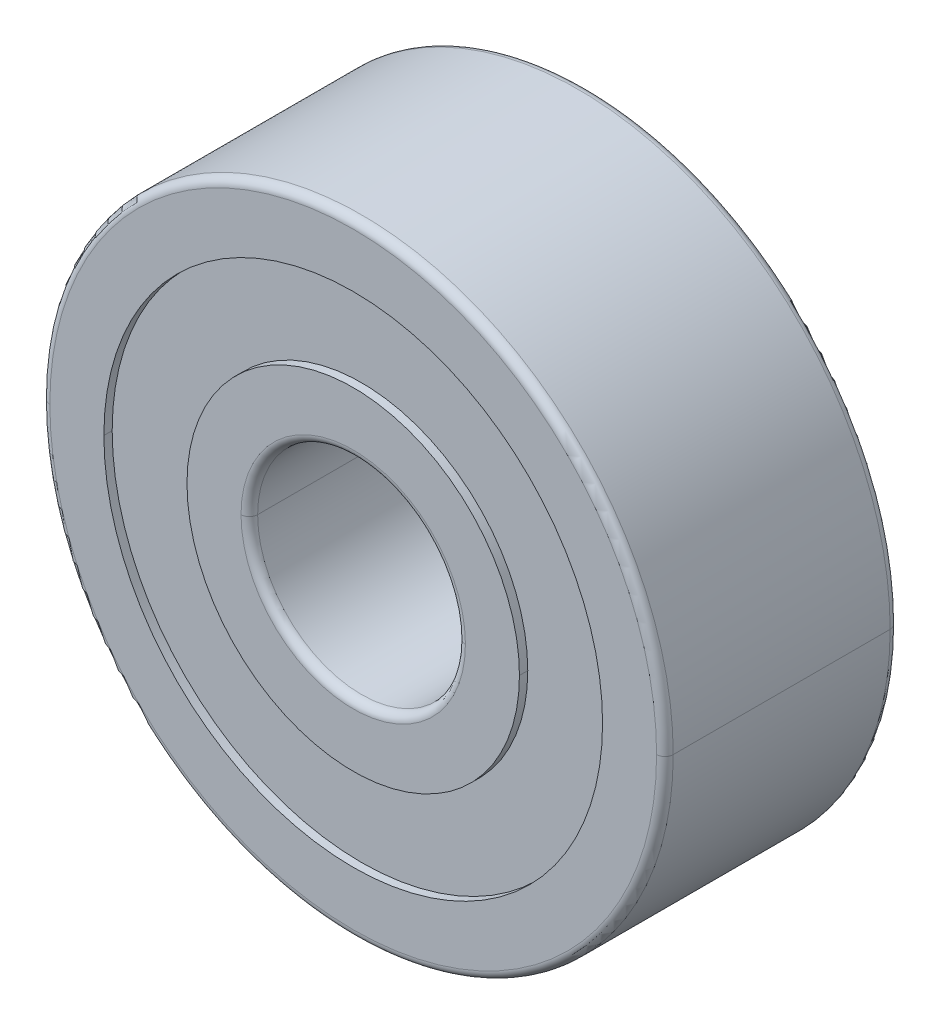
ISO-10303-21;
HEADER;
FILE_DESCRIPTION(('STEP AP214'),'2;1');
FILE_NAME('part.step','',(''),(''),'','','');
FILE_SCHEMA(('AUTOMOTIVE_DESIGN { 1 0 10303 214 1 1 1 1 }'));
ENDSEC;
DATA;
#1=APPLICATION_CONTEXT('core data for automotive mechanical design processes');
#2=APPLICATION_PROTOCOL_DEFINITION('international standard','automotive_design',2000,#1);
#3=PRODUCT_CONTEXT('',#1,'mechanical');
#4=PRODUCT('Part','Part','',(#3));
#5=PRODUCT_RELATED_PRODUCT_CATEGORY('part','',(#4));
#6=PRODUCT_DEFINITION_FORMATION('','',#4);
#7=PRODUCT_DEFINITION_CONTEXT('part definition',#1,'design');
#8=PRODUCT_DEFINITION('design','',#6,#7);
#9=PRODUCT_DEFINITION_SHAPE('','',#8);
#10=(LENGTH_UNIT() NAMED_UNIT(*) SI_UNIT(.MILLI.,.METRE.));
#11=(NAMED_UNIT(*) PLANE_ANGLE_UNIT() SI_UNIT($,.RADIAN.));
#12=(NAMED_UNIT(*) SI_UNIT($,.STERADIAN.) SOLID_ANGLE_UNIT());
#13=UNCERTAINTY_MEASURE_WITH_UNIT(LENGTH_MEASURE(1.E-05),#10,'distance_accuracy_value','');
#14=(GEOMETRIC_REPRESENTATION_CONTEXT(3) GLOBAL_UNCERTAINTY_ASSIGNED_CONTEXT((#13)) GLOBAL_UNIT_ASSIGNED_CONTEXT((#10,
#11,#12)) REPRESENTATION_CONTEXT('',''));
#15=CARTESIAN_POINT('',(0.,0.,0.));
#16=DIRECTION('',(0.,0.,1.));
#17=DIRECTION('',(1.,0.,0.));
#18=AXIS2_PLACEMENT_3D('',#15,#16,#17);
#19=CARTESIAN_POINT('',(0.,0.,3.3147));
#20=DIRECTION('',(0.,0.,1.));
#21=DIRECTION('',(1.,0.,0.));
#22=AXIS2_PLACEMENT_3D('',#19,#20,#21);
#23=TOROIDAL_SURFACE('',#22,9.271,0.254);
#24=CARTESIAN_POINT('',(-9.271,0.,3.3147));
#25=DIRECTION('',(0.,1.,0.));
#26=DIRECTION('',(-1.,0.,0.));
#27=AXIS2_PLACEMENT_3D('',#24,#25,#26);
#28=CIRCLE('',#27,0.254);
#29=CARTESIAN_POINT('',(-9.525,0.,3.3147));
#30=VERTEX_POINT('',#29);
#31=CARTESIAN_POINT('',(-9.271,0.,3.5687));
#32=VERTEX_POINT('',#31);
#33=EDGE_CURVE('E294',#30,#32,#28,.T.);
#34=ORIENTED_EDGE('',*,*,#33,.F.);
#35=CARTESIAN_POINT('',(0.,0.,3.3147));
#36=DIRECTION('',(0.,0.,-1.));
#37=DIRECTION('',(1.,0.,0.));
#38=AXIS2_PLACEMENT_3D('',#35,#36,#37);
#39=CIRCLE('',#38,9.525);
#40=CARTESIAN_POINT('',(9.525,0.,3.3147));
#41=VERTEX_POINT('',#40);
#42=EDGE_CURVE('E273',#41,#30,#39,.T.);
#43=ORIENTED_EDGE('',*,*,#42,.F.);
#44=CARTESIAN_POINT('',(9.271,0.,3.3147));
#45=DIRECTION('',(0.,-1.,0.));
#46=DIRECTION('',(0.,0.,-1.));
#47=AXIS2_PLACEMENT_3D('',#44,#45,#46);
#48=CIRCLE('',#47,0.254);
#49=CARTESIAN_POINT('',(9.271,0.,3.5687));
#50=VERTEX_POINT('',#49);
#51=EDGE_CURVE('E255',#41,#50,#48,.T.);
#52=ORIENTED_EDGE('',*,*,#51,.T.);
#53=CARTESIAN_POINT('',(0.,0.,3.5687));
#54=DIRECTION('',(0.,0.,1.));
#55=DIRECTION('',(1.,0.,0.));
#56=AXIS2_PLACEMENT_3D('',#53,#54,#55);
#57=CIRCLE('',#56,9.271);
#58=EDGE_CURVE('E249',#32,#50,#57,.T.);
#59=ORIENTED_EDGE('',*,*,#58,.F.);
#60=EDGE_LOOP('',(#34,#43,#52,#59));
#61=FACE_BOUND('',#60,.T.);
#62=ADVANCED_FACE('F14',(#61),#23,.T.);
#63=CARTESIAN_POINT('',(0.,0.,-3.3147));
#64=DIRECTION('',(0.,0.,1.));
#65=DIRECTION('',(1.,0.,0.));
#66=AXIS2_PLACEMENT_3D('',#63,#64,#65);
#67=TOROIDAL_SURFACE('',#66,9.271,0.254);
#68=CARTESIAN_POINT('',(-9.271,0.,-3.3147));
#69=DIRECTION('',(0.,1.,0.));
#70=DIRECTION('',(-1.,0.,0.));
#71=AXIS2_PLACEMENT_3D('',#68,#69,#70);
#72=CIRCLE('',#71,0.254);
#73=CARTESIAN_POINT('',(-9.271,0.,-3.5687));
#74=VERTEX_POINT('',#73);
#75=CARTESIAN_POINT('',(-9.525,0.,-3.3147));
#76=VERTEX_POINT('',#75);
#77=EDGE_CURVE('E254',#74,#76,#72,.T.);
#78=ORIENTED_EDGE('',*,*,#77,.F.);
#79=CARTESIAN_POINT('',(0.,0.,-3.5687));
#80=DIRECTION('',(0.,0.,-1.));
#81=DIRECTION('',(1.,0.,0.));
#82=AXIS2_PLACEMENT_3D('',#79,#80,#81);
#83=CIRCLE('',#82,9.271);
#84=CARTESIAN_POINT('',(9.271,0.,-3.5687));
#85=VERTEX_POINT('',#84);
#86=EDGE_CURVE('E248',#85,#74,#83,.T.);
#87=ORIENTED_EDGE('',*,*,#86,.F.);
#88=CARTESIAN_POINT('',(9.271,0.,-3.3147));
#89=DIRECTION('',(0.,-1.,0.));
#90=DIRECTION('',(0.,0.,-1.));
#91=AXIS2_PLACEMENT_3D('',#88,#89,#90);
#92=CIRCLE('',#91,0.254);
#93=CARTESIAN_POINT('',(9.525,0.,-3.3147));
#94=VERTEX_POINT('',#93);
#95=EDGE_CURVE('E328',#85,#94,#92,.T.);
#96=ORIENTED_EDGE('',*,*,#95,.T.);
#97=CARTESIAN_POINT('',(0.,0.,-3.3147));
#98=DIRECTION('',(0.,0.,1.));
#99=DIRECTION('',(1.,0.,0.));
#100=AXIS2_PLACEMENT_3D('',#97,#98,#99);
#101=CIRCLE('',#100,9.525);
#102=EDGE_CURVE('E276',#76,#94,#101,.T.);
#103=ORIENTED_EDGE('',*,*,#102,.F.);
#104=EDGE_LOOP('',(#78,#87,#96,#103));
#105=FACE_BOUND('',#104,.T.);
#106=ADVANCED_FACE('F428',(#105),#67,.T.);
#107=CARTESIAN_POINT('',(0.,0.,3.3147));
#108=DIRECTION('',(0.,0.,1.));
#109=DIRECTION('',(1.,0.,0.));
#110=AXIS2_PLACEMENT_3D('',#107,#108,#109);
#111=TOROIDAL_SURFACE('',#110,3.429,0.254);
#112=CARTESIAN_POINT('',(-3.429,0.,3.3147));
#113=DIRECTION('',(0.,1.,0.));
#114=DIRECTION('',(-1.,0.,0.));
#115=AXIS2_PLACEMENT_3D('',#112,#113,#114);
#116=CIRCLE('',#115,0.254);
#117=CARTESIAN_POINT('',(-3.429,0.,3.5687));
#118=VERTEX_POINT('',#117);
#119=CARTESIAN_POINT('',(-3.175,0.,3.3147));
#120=VERTEX_POINT('',#119);
#121=EDGE_CURVE('E327',#118,#120,#116,.T.);
#122=ORIENTED_EDGE('',*,*,#121,.F.);
#123=CARTESIAN_POINT('',(0.,0.,3.5687));
#124=DIRECTION('',(0.,0.,-1.));
#125=DIRECTION('',(1.,0.,0.));
#126=AXIS2_PLACEMENT_3D('',#123,#124,#125);
#127=CIRCLE('',#126,3.429);
#128=CARTESIAN_POINT('',(3.429,0.,3.5687));
#129=VERTEX_POINT('',#128);
#130=EDGE_CURVE('E287',#129,#118,#127,.T.);
#131=ORIENTED_EDGE('',*,*,#130,.F.);
#132=CARTESIAN_POINT('',(3.429,0.,3.3147));
#133=DIRECTION('',(0.,-1.,0.));
#134=DIRECTION('',(0.,0.,-1.));
#135=AXIS2_PLACEMENT_3D('',#132,#133,#134);
#136=CIRCLE('',#135,0.254);
#137=CARTESIAN_POINT('',(3.175,0.,3.3147));
#138=VERTEX_POINT('',#137);
#139=EDGE_CURVE('E227',#129,#138,#136,.T.);
#140=ORIENTED_EDGE('',*,*,#139,.T.);
#141=CARTESIAN_POINT('',(0.,0.,3.3147));
#142=DIRECTION('',(0.,0.,1.));
#143=DIRECTION('',(1.,0.,0.));
#144=AXIS2_PLACEMENT_3D('',#141,#142,#143);
#145=CIRCLE('',#144,3.175);
#146=EDGE_CURVE('E239',#120,#138,#145,.T.);
#147=ORIENTED_EDGE('',*,*,#146,.F.);
#148=EDGE_LOOP('',(#122,#131,#140,#147));
#149=FACE_BOUND('',#148,.T.);
#150=ADVANCED_FACE('F434',(#149),#111,.T.);
#151=CARTESIAN_POINT('',(0.,0.,-3.3147));
#152=DIRECTION('',(0.,0.,1.));
#153=DIRECTION('',(1.,0.,0.));
#154=AXIS2_PLACEMENT_3D('',#151,#152,#153);
#155=TOROIDAL_SURFACE('',#154,3.429,0.254);
#156=CARTESIAN_POINT('',(-3.429,0.,-3.3147));
#157=DIRECTION('',(0.,1.,0.));
#158=DIRECTION('',(-1.,0.,0.));
#159=AXIS2_PLACEMENT_3D('',#156,#157,#158);
#160=CIRCLE('',#159,0.254);
#161=CARTESIAN_POINT('',(-3.175,0.,-3.3147));
#162=VERTEX_POINT('',#161);
#163=CARTESIAN_POINT('',(-3.429,0.,-3.5687));
#164=VERTEX_POINT('',#163);
#165=EDGE_CURVE('E290',#162,#164,#160,.T.);
#166=ORIENTED_EDGE('',*,*,#165,.F.);
#167=CARTESIAN_POINT('',(0.,0.,-3.3147));
#168=DIRECTION('',(0.,0.,-1.));
#169=DIRECTION('',(1.,0.,0.));
#170=AXIS2_PLACEMENT_3D('',#167,#168,#169);
#171=CIRCLE('',#170,3.175);
#172=CARTESIAN_POINT('',(3.175,0.,-3.3147));
#173=VERTEX_POINT('',#172);
#174=EDGE_CURVE('E333',#173,#162,#171,.T.);
#175=ORIENTED_EDGE('',*,*,#174,.F.);
#176=CARTESIAN_POINT('',(3.429,0.,-3.3147));
#177=DIRECTION('',(0.,-1.,0.));
#178=DIRECTION('',(0.,0.,-1.));
#179=AXIS2_PLACEMENT_3D('',#176,#177,#178);
#180=CIRCLE('',#179,0.254);
#181=CARTESIAN_POINT('',(3.429,0.,-3.5687));
#182=VERTEX_POINT('',#181);
#183=EDGE_CURVE('E214',#173,#182,#180,.T.);
#184=ORIENTED_EDGE('',*,*,#183,.T.);
#185=CARTESIAN_POINT('',(0.,0.,-3.5687));
#186=DIRECTION('',(0.,0.,1.));
#187=DIRECTION('',(1.,0.,0.));
#188=AXIS2_PLACEMENT_3D('',#185,#186,#187);
#189=CIRCLE('',#188,3.429);
#190=EDGE_CURVE('E260',#164,#182,#189,.T.);
#191=ORIENTED_EDGE('',*,*,#190,.F.);
#192=EDGE_LOOP('',(#166,#175,#184,#191));
#193=FACE_BOUND('',#192,.T.);
#194=ADVANCED_FACE('F449',(#193),#155,.T.);
#195=CARTESIAN_POINT('',(0.,0.,-3.3147));
#196=DIRECTION('',(0.,0.,-1.));
#197=DIRECTION('',(-1.,0.,0.));
#198=AXIS2_PLACEMENT_3D('',#195,#196,#197);
#199=CYLINDRICAL_SURFACE('',#198,5.08);
#200=DIRECTION('',(0.,0.,-1.));
#201=VECTOR('',#200,1.);
#202=CARTESIAN_POINT('',(5.08,0.,-3.3147));
#203=LINE('',#202,#201);
#204=CARTESIAN_POINT('',(5.08,0.,-3.3147));
#205=VERTEX_POINT('',#204);
#206=CARTESIAN_POINT('',(5.08,0.,-3.5687));
#207=VERTEX_POINT('',#206);
#208=EDGE_CURVE('E202',#205,#207,#203,.T.);
#209=ORIENTED_EDGE('',*,*,#208,.F.);
#210=CARTESIAN_POINT('',(0.,0.,-3.3147));
#211=DIRECTION('',(0.,0.,1.));
#212=DIRECTION('',(1.,0.,0.));
#213=AXIS2_PLACEMENT_3D('',#210,#211,#212);
#214=CIRCLE('',#213,5.08);
#215=CARTESIAN_POINT('',(-5.08,0.,-3.3147));
#216=VERTEX_POINT('',#215);
#217=EDGE_CURVE('E9',#216,#205,#214,.T.);
#218=ORIENTED_EDGE('',*,*,#217,.F.);
#219=DIRECTION('',(0.,0.,-1.));
#220=VECTOR('',#219,1.);
#221=CARTESIAN_POINT('',(-5.08,0.,-3.3147));
#222=LINE('',#221,#220);
#223=CARTESIAN_POINT('',(-5.08,0.,-3.5687));
#224=VERTEX_POINT('',#223);
#225=EDGE_CURVE('E212',#216,#224,#222,.T.);
#226=ORIENTED_EDGE('',*,*,#225,.T.);
#227=CARTESIAN_POINT('',(0.,0.,-3.5687));
#228=DIRECTION('',(0.,0.,1.));
#229=DIRECTION('',(1.,0.,0.));
#230=AXIS2_PLACEMENT_3D('',#227,#228,#229);
#231=CIRCLE('',#230,5.08);
#232=EDGE_CURVE('E204',#224,#207,#231,.T.);
#233=ORIENTED_EDGE('',*,*,#232,.T.);
#234=EDGE_LOOP('',(#209,#218,#226,#233));
#235=FACE_BOUND('',#234,.T.);
#236=ADVANCED_FACE('F203',(#235),#199,.T.);
#237=CARTESIAN_POINT('',(0.,0.,-3.3147));
#238=DIRECTION('',(0.,0.,-1.));
#239=DIRECTION('',(-1.,0.,0.));
#240=AXIS2_PLACEMENT_3D('',#237,#238,#239);
#241=CYLINDRICAL_SURFACE('',#240,7.62);
#242=DIRECTION('',(0.,0.,-1.));
#243=VECTOR('',#242,1.);
#244=CARTESIAN_POINT('',(7.62,0.,-3.3147));
#245=LINE('',#244,#243);
#246=CARTESIAN_POINT('',(7.62,0.,-3.3147));
#247=VERTEX_POINT('',#246);
#248=CARTESIAN_POINT('',(7.62,0.,-3.5687));
#249=VERTEX_POINT('',#248);
#250=EDGE_CURVE('E268',#247,#249,#245,.T.);
#251=ORIENTED_EDGE('',*,*,#250,.F.);
#252=CARTESIAN_POINT('',(0.,0.,-3.3147));
#253=DIRECTION('',(0.,0.,1.));
#254=DIRECTION('',(1.,0.,0.));
#255=AXIS2_PLACEMENT_3D('',#252,#253,#254);
#256=CIRCLE('',#255,7.62);
#257=CARTESIAN_POINT('',(-7.62,0.,-3.3147));
#258=VERTEX_POINT('',#257);
#259=EDGE_CURVE('E25',#247,#258,#256,.T.);
#260=ORIENTED_EDGE('',*,*,#259,.T.);
#261=DIRECTION('',(0.,0.,-1.));
#262=VECTOR('',#261,1.);
#263=CARTESIAN_POINT('',(-7.62,0.,-3.3147));
#264=LINE('',#263,#262);
#265=CARTESIAN_POINT('',(-7.62,0.,-3.5687));
#266=VERTEX_POINT('',#265);
#267=EDGE_CURVE('E267',#258,#266,#264,.T.);
#268=ORIENTED_EDGE('',*,*,#267,.T.);
#269=CARTESIAN_POINT('',(0.,0.,-3.5687));
#270=DIRECTION('',(0.,0.,1.));
#271=DIRECTION('',(1.,0.,0.));
#272=AXIS2_PLACEMENT_3D('',#269,#270,#271);
#273=CIRCLE('',#272,7.62);
#274=EDGE_CURVE('E140',#249,#266,#273,.T.);
#275=ORIENTED_EDGE('',*,*,#274,.F.);
#276=EDGE_LOOP('',(#251,#260,#268,#275));
#277=FACE_BOUND('',#276,.T.);
#278=ADVANCED_FACE('F438',(#277),#241,.F.);
#279=CARTESIAN_POINT('',(0.,0.,-3.3147));
#280=DIRECTION('',(0.,0.,-1.));
#281=DIRECTION('',(0.,-1.,0.));
#282=AXIS2_PLACEMENT_3D('',#279,#280,#281);
#283=PLANE('',#282);
#284=ORIENTED_EDGE('',*,*,#217,.T.);
#285=CARTESIAN_POINT('',(0.,0.,-3.3147));
#286=DIRECTION('',(0.,0.,1.));
#287=DIRECTION('',(1.,0.,0.));
#288=AXIS2_PLACEMENT_3D('',#285,#286,#287);
#289=CIRCLE('',#288,5.08);
#290=EDGE_CURVE('E196',#205,#216,#289,.T.);
#291=ORIENTED_EDGE('',*,*,#290,.T.);
#292=EDGE_LOOP('',(#284,#291));
#293=FACE_BOUND('',#292,.T.);
#294=CARTESIAN_POINT('',(0.,0.,-3.3147));
#295=DIRECTION('',(0.,0.,1.));
#296=DIRECTION('',(1.,0.,0.));
#297=AXIS2_PLACEMENT_3D('',#294,#295,#296);
#298=CIRCLE('',#297,7.62);
#299=EDGE_CURVE('E281',#258,#247,#298,.T.);
#300=ORIENTED_EDGE('',*,*,#299,.F.);
#301=ORIENTED_EDGE('',*,*,#259,.F.);
#302=EDGE_LOOP('',(#300,#301));
#303=FACE_BOUND('',#302,.T.);
#304=ADVANCED_FACE('F194',(#293,#303),#283,.T.);
#305=CARTESIAN_POINT('',(0.,0.,3.3147));
#306=DIRECTION('',(0.,0.,1.));
#307=DIRECTION('',(1.,0.,0.));
#308=AXIS2_PLACEMENT_3D('',#305,#306,#307);
#309=CYLINDRICAL_SURFACE('',#308,5.08);
#310=DIRECTION('',(0.,0.,1.));
#311=VECTOR('',#310,1.);
#312=CARTESIAN_POINT('',(-5.08,0.,3.3147));
#313=LINE('',#312,#311);
#314=CARTESIAN_POINT('',(-5.08,0.,3.3147));
#315=VERTEX_POINT('',#314);
#316=CARTESIAN_POINT('',(-5.08,0.,3.5687));
#317=VERTEX_POINT('',#316);
#318=EDGE_CURVE('E233',#315,#317,#313,.T.);
#319=ORIENTED_EDGE('',*,*,#318,.F.);
#320=CARTESIAN_POINT('',(0.,0.,3.3147));
#321=DIRECTION('',(0.,0.,1.));
#322=DIRECTION('',(1.,0.,0.));
#323=AXIS2_PLACEMENT_3D('',#320,#321,#322);
#324=CIRCLE('',#323,5.08);
#325=CARTESIAN_POINT('',(5.08,0.,3.3147));
#326=VERTEX_POINT('',#325);
#327=EDGE_CURVE('E174',#315,#326,#324,.T.);
#328=ORIENTED_EDGE('',*,*,#327,.T.);
#329=DIRECTION('',(0.,0.,1.));
#330=VECTOR('',#329,1.);
#331=CARTESIAN_POINT('',(5.08,0.,3.3147));
#332=LINE('',#331,#330);
#333=CARTESIAN_POINT('',(5.08,0.,3.5687));
#334=VERTEX_POINT('',#333);
#335=EDGE_CURVE('E256',#326,#334,#332,.T.);
#336=ORIENTED_EDGE('',*,*,#335,.T.);
#337=CARTESIAN_POINT('',(0.,0.,3.5687));
#338=DIRECTION('',(0.,0.,1.));
#339=DIRECTION('',(1.,0.,0.));
#340=AXIS2_PLACEMENT_3D('',#337,#338,#339);
#341=CIRCLE('',#340,5.08);
#342=EDGE_CURVE('E263',#317,#334,#341,.T.);
#343=ORIENTED_EDGE('',*,*,#342,.F.);
#344=EDGE_LOOP('',(#319,#328,#336,#343));
#345=FACE_BOUND('',#344,.T.);
#346=ADVANCED_FACE('F443',(#345),#309,.T.);
#347=CARTESIAN_POINT('',(0.,0.,3.3147));
#348=DIRECTION('',(0.,0.,1.));
#349=DIRECTION('',(1.,0.,0.));
#350=AXIS2_PLACEMENT_3D('',#347,#348,#349);
#351=PLANE('',#350);
#352=CARTESIAN_POINT('',(0.,0.,3.3147));
#353=DIRECTION('',(0.,0.,1.));
#354=DIRECTION('',(1.,0.,0.));
#355=AXIS2_PLACEMENT_3D('',#352,#353,#354);
#356=CIRCLE('',#355,5.08);
#357=EDGE_CURVE('E238',#326,#315,#356,.T.);
#358=ORIENTED_EDGE('',*,*,#357,.F.);
#359=ORIENTED_EDGE('',*,*,#327,.F.);
#360=EDGE_LOOP('',(#358,#359));
#361=FACE_BOUND('',#360,.T.);
#362=CARTESIAN_POINT('',(0.,0.,3.3147));
#363=DIRECTION('',(0.,0.,1.));
#364=DIRECTION('',(1.,0.,0.));
#365=AXIS2_PLACEMENT_3D('',#362,#363,#364);
#366=CIRCLE('',#365,7.62);
#367=CARTESIAN_POINT('',(7.62,0.,3.3147));
#368=VERTEX_POINT('',#367);
#369=CARTESIAN_POINT('',(-7.62,0.,3.3147));
#370=VERTEX_POINT('',#369);
#371=EDGE_CURVE('E313',#368,#370,#366,.T.);
#372=ORIENTED_EDGE('',*,*,#371,.T.);
#373=CARTESIAN_POINT('',(0.,0.,3.3147));
#374=DIRECTION('',(0.,0.,1.));
#375=DIRECTION('',(1.,0.,0.));
#376=AXIS2_PLACEMENT_3D('',#373,#374,#375);
#377=CIRCLE('',#376,7.62);
#378=EDGE_CURVE('E259',#370,#368,#377,.T.);
#379=ORIENTED_EDGE('',*,*,#378,.T.);
#380=EDGE_LOOP('',(#372,#379));
#381=FACE_BOUND('',#380,.T.);
#382=ADVANCED_FACE('F404',(#361,#381),#351,.T.);
#383=CARTESIAN_POINT('',(0.,0.,3.3147));
#384=DIRECTION('',(0.,0.,1.));
#385=DIRECTION('',(1.,0.,0.));
#386=AXIS2_PLACEMENT_3D('',#383,#384,#385);
#387=CYLINDRICAL_SURFACE('',#386,7.62);
#388=DIRECTION('',(0.,0.,1.));
#389=VECTOR('',#388,1.);
#390=CARTESIAN_POINT('',(-7.62,0.,3.3147));
#391=LINE('',#390,#389);
#392=CARTESIAN_POINT('',(-7.62,0.,3.5687));
#393=VERTEX_POINT('',#392);
#394=EDGE_CURVE('E272',#370,#393,#391,.T.);
#395=ORIENTED_EDGE('',*,*,#394,.F.);
#396=ORIENTED_EDGE('',*,*,#371,.F.);
#397=DIRECTION('',(0.,0.,1.));
#398=VECTOR('',#397,1.);
#399=CARTESIAN_POINT('',(7.62,0.,3.3147));
#400=LINE('',#399,#398);
#401=CARTESIAN_POINT('',(7.62,0.,3.5687));
#402=VERTEX_POINT('',#401);
#403=EDGE_CURVE('E242',#368,#402,#400,.T.);
#404=ORIENTED_EDGE('',*,*,#403,.T.);
#405=CARTESIAN_POINT('',(0.,0.,3.5687));
#406=DIRECTION('',(0.,0.,1.));
#407=DIRECTION('',(1.,0.,0.));
#408=AXIS2_PLACEMENT_3D('',#405,#406,#407);
#409=CIRCLE('',#408,7.62);
#410=EDGE_CURVE('E39',#402,#393,#409,.T.);
#411=ORIENTED_EDGE('',*,*,#410,.T.);
#412=EDGE_LOOP('',(#395,#396,#404,#411));
#413=FACE_BOUND('',#412,.T.);
#414=ADVANCED_FACE('F408',(#413),#387,.F.);
#415=CARTESIAN_POINT('',(0.,0.,3.5687));
#416=DIRECTION('',(0.,0.,-1.));
#417=DIRECTION('',(-1.,0.,0.));
#418=AXIS2_PLACEMENT_3D('',#415,#416,#417);
#419=CYLINDRICAL_SURFACE('',#418,3.175);
#420=DIRECTION('',(0.,0.,-1.));
#421=VECTOR('',#420,1.);
#422=CARTESIAN_POINT('',(3.175,0.,3.5687));
#423=LINE('',#422,#421);
#424=EDGE_CURVE('E86',#138,#173,#423,.T.);
#425=ORIENTED_EDGE('',*,*,#424,.F.);
#426=CARTESIAN_POINT('',(0.,0.,3.3147));
#427=DIRECTION('',(0.,0.,1.));
#428=DIRECTION('',(1.,0.,0.));
#429=AXIS2_PLACEMENT_3D('',#426,#427,#428);
#430=CIRCLE('',#429,3.175);
#431=EDGE_CURVE('E232',#138,#120,#430,.T.);
#432=ORIENTED_EDGE('',*,*,#431,.T.);
#433=DIRECTION('',(0.,0.,-1.));
#434=VECTOR('',#433,1.);
#435=CARTESIAN_POINT('',(-3.175,0.,3.5687));
#436=LINE('',#435,#434);
#437=EDGE_CURVE('E74',#120,#162,#436,.T.);
#438=ORIENTED_EDGE('',*,*,#437,.T.);
#439=CARTESIAN_POINT('',(0.,0.,-3.3147));
#440=DIRECTION('',(0.,0.,-1.));
#441=DIRECTION('',(1.,0.,0.));
#442=AXIS2_PLACEMENT_3D('',#439,#440,#441);
#443=CIRCLE('',#442,3.175);
#444=EDGE_CURVE('E231',#162,#173,#443,.T.);
#445=ORIENTED_EDGE('',*,*,#444,.T.);
#446=EDGE_LOOP('',(#425,#432,#438,#445));
#447=FACE_BOUND('',#446,.T.);
#448=ADVANCED_FACE('F463',(#447),#419,.F.);
#449=CARTESIAN_POINT('',(0.,0.,3.5687));
#450=DIRECTION('',(0.,0.,-1.));
#451=DIRECTION('',(-1.,0.,0.));
#452=AXIS2_PLACEMENT_3D('',#449,#450,#451);
#453=CYLINDRICAL_SURFACE('',#452,9.525);
#454=DIRECTION('',(0.,0.,-1.));
#455=VECTOR('',#454,1.);
#456=CARTESIAN_POINT('',(9.525,0.,3.5687));
#457=LINE('',#456,#455);
#458=EDGE_CURVE('E225',#41,#94,#457,.T.);
#459=ORIENTED_EDGE('',*,*,#458,.F.);
#460=ORIENTED_EDGE('',*,*,#42,.T.);
#461=DIRECTION('',(0.,0.,-1.));
#462=VECTOR('',#461,1.);
#463=CARTESIAN_POINT('',(-9.525,0.,3.5687));
#464=LINE('',#463,#462);
#465=EDGE_CURVE('E350',#30,#76,#464,.T.);
#466=ORIENTED_EDGE('',*,*,#465,.T.);
#467=ORIENTED_EDGE('',*,*,#102,.T.);
#468=EDGE_LOOP('',(#459,#460,#466,#467));
#469=FACE_BOUND('',#468,.T.);
#470=ADVANCED_FACE('F423',(#469),#453,.T.);
#471=CARTESIAN_POINT('',(0.,0.,-3.5687));
#472=DIRECTION('',(0.,0.,1.));
#473=DIRECTION('',(1.,0.,0.));
#474=AXIS2_PLACEMENT_3D('',#471,#472,#473);
#475=PLANE('',#474);
#476=CARTESIAN_POINT('',(0.,0.,-3.5687));
#477=DIRECTION('',(0.,0.,1.));
#478=DIRECTION('',(1.,0.,0.));
#479=AXIS2_PLACEMENT_3D('',#476,#477,#478);
#480=CIRCLE('',#479,7.62);
#481=EDGE_CURVE('E264',#266,#249,#480,.T.);
#482=ORIENTED_EDGE('',*,*,#481,.T.);
#483=ORIENTED_EDGE('',*,*,#274,.T.);
#484=EDGE_LOOP('',(#482,#483));
#485=FACE_BOUND('',#484,.T.);
#486=ORIENTED_EDGE('',*,*,#86,.T.);
#487=CARTESIAN_POINT('',(0.,0.,-3.5687));
#488=DIRECTION('',(0.,0.,-1.));
#489=DIRECTION('',(1.,0.,0.));
#490=AXIS2_PLACEMENT_3D('',#487,#488,#489);
#491=CIRCLE('',#490,9.271);
#492=EDGE_CURVE('E250',#74,#85,#491,.T.);
#493=ORIENTED_EDGE('',*,*,#492,.T.);
#494=EDGE_LOOP('',(#486,#493));
#495=FACE_BOUND('',#494,.T.);
#496=ADVANCED_FACE('F16',(#485,#495),#475,.F.);
#497=CARTESIAN_POINT('',(0.,0.,3.5687));
#498=DIRECTION('',(0.,0.,1.));
#499=DIRECTION('',(1.,0.,0.));
#500=AXIS2_PLACEMENT_3D('',#497,#498,#499);
#501=PLANE('',#500);
#502=ORIENTED_EDGE('',*,*,#410,.F.);
#503=CARTESIAN_POINT('',(0.,0.,3.5687));
#504=DIRECTION('',(0.,0.,1.));
#505=DIRECTION('',(1.,0.,0.));
#506=AXIS2_PLACEMENT_3D('',#503,#504,#505);
#507=CIRCLE('',#506,7.62);
#508=EDGE_CURVE('E245',#393,#402,#507,.T.);
#509=ORIENTED_EDGE('',*,*,#508,.F.);
#510=EDGE_LOOP('',(#502,#509));
#511=FACE_BOUND('',#510,.T.);
#512=CARTESIAN_POINT('',(0.,0.,3.5687));
#513=DIRECTION('',(0.,0.,1.));
#514=DIRECTION('',(1.,0.,0.));
#515=AXIS2_PLACEMENT_3D('',#512,#513,#514);
#516=CIRCLE('',#515,9.271);
#517=EDGE_CURVE('E291',#50,#32,#516,.T.);
#518=ORIENTED_EDGE('',*,*,#517,.T.);
#519=ORIENTED_EDGE('',*,*,#58,.T.);
#520=EDGE_LOOP('',(#518,#519));
#521=FACE_BOUND('',#520,.T.);
#522=ADVANCED_FACE('F411',(#511,#521),#501,.T.);
#523=CARTESIAN_POINT('',(0.,0.,3.5687));
#524=DIRECTION('',(0.,0.,1.));
#525=DIRECTION('',(1.,0.,0.));
#526=AXIS2_PLACEMENT_3D('',#523,#524,#525);
#527=PLANE('',#526);
#528=ORIENTED_EDGE('',*,*,#130,.T.);
#529=CARTESIAN_POINT('',(0.,0.,3.5687));
#530=DIRECTION('',(0.,0.,-1.));
#531=DIRECTION('',(1.,0.,0.));
#532=AXIS2_PLACEMENT_3D('',#529,#530,#531);
#533=CIRCLE('',#532,3.429);
#534=EDGE_CURVE('E323',#118,#129,#533,.T.);
#535=ORIENTED_EDGE('',*,*,#534,.T.);
#536=EDGE_LOOP('',(#528,#535));
#537=FACE_BOUND('',#536,.T.);
#538=CARTESIAN_POINT('',(0.,0.,3.5687));
#539=DIRECTION('',(0.,0.,1.));
#540=DIRECTION('',(1.,0.,0.));
#541=AXIS2_PLACEMENT_3D('',#538,#539,#540);
#542=CIRCLE('',#541,5.08);
#543=EDGE_CURVE('E237',#334,#317,#542,.T.);
#544=ORIENTED_EDGE('',*,*,#543,.T.);
#545=ORIENTED_EDGE('',*,*,#342,.T.);
#546=EDGE_LOOP('',(#544,#545));
#547=FACE_BOUND('',#546,.T.);
#548=ADVANCED_FACE('F413',(#537,#547),#527,.T.);
#549=CARTESIAN_POINT('',(0.,0.,-3.5687));
#550=DIRECTION('',(0.,0.,1.));
#551=DIRECTION('',(1.,0.,0.));
#552=AXIS2_PLACEMENT_3D('',#549,#550,#551);
#553=PLANE('',#552);
#554=CARTESIAN_POINT('',(0.,0.,-3.5687));
#555=DIRECTION('',(0.,0.,1.));
#556=DIRECTION('',(1.,0.,0.));
#557=AXIS2_PLACEMENT_3D('',#554,#555,#556);
#558=CIRCLE('',#557,3.429);
#559=EDGE_CURVE('E221',#182,#164,#558,.T.);
#560=ORIENTED_EDGE('',*,*,#559,.T.);
#561=ORIENTED_EDGE('',*,*,#190,.T.);
#562=EDGE_LOOP('',(#560,#561));
#563=FACE_BOUND('',#562,.T.);
#564=ORIENTED_EDGE('',*,*,#232,.F.);
#565=CARTESIAN_POINT('',(0.,0.,-3.5687));
#566=DIRECTION('',(0.,0.,1.));
#567=DIRECTION('',(1.,0.,0.));
#568=AXIS2_PLACEMENT_3D('',#565,#566,#567);
#569=CIRCLE('',#568,5.08);
#570=EDGE_CURVE('E209',#207,#224,#569,.T.);
#571=ORIENTED_EDGE('',*,*,#570,.F.);
#572=EDGE_LOOP('',(#564,#571));
#573=FACE_BOUND('',#572,.T.);
#574=ADVANCED_FACE('F420',(#563,#573),#553,.F.);
#575=CARTESIAN_POINT('',(0.,0.,3.5687));
#576=DIRECTION('',(0.,0.,-1.));
#577=DIRECTION('',(-1.,0.,0.));
#578=AXIS2_PLACEMENT_3D('',#575,#576,#577);
#579=CYLINDRICAL_SURFACE('',#578,9.525);
#580=CARTESIAN_POINT('',(0.,0.,3.3147));
#581=DIRECTION('',(0.,0.,-1.));
#582=DIRECTION('',(1.,0.,0.));
#583=AXIS2_PLACEMENT_3D('',#580,#581,#582);
#584=CIRCLE('',#583,9.525);
#585=EDGE_CURVE('E18',#30,#41,#584,.T.);
#586=ORIENTED_EDGE('',*,*,#585,.T.);
#587=ORIENTED_EDGE('',*,*,#458,.T.);
#588=CARTESIAN_POINT('',(0.,0.,-3.3147));
#589=DIRECTION('',(0.,0.,1.));
#590=DIRECTION('',(1.,0.,0.));
#591=AXIS2_PLACEMENT_3D('',#588,#589,#590);
#592=CIRCLE('',#591,9.525);
#593=EDGE_CURVE('E337',#94,#76,#592,.T.);
#594=ORIENTED_EDGE('',*,*,#593,.T.);
#595=ORIENTED_EDGE('',*,*,#465,.F.);
#596=EDGE_LOOP('',(#586,#587,#594,#595));
#597=FACE_BOUND('',#596,.T.);
#598=ADVANCED_FACE('F447',(#597),#579,.T.);
#599=CARTESIAN_POINT('',(0.,0.,3.5687));
#600=DIRECTION('',(0.,0.,-1.));
#601=DIRECTION('',(-1.,0.,0.));
#602=AXIS2_PLACEMENT_3D('',#599,#600,#601);
#603=CYLINDRICAL_SURFACE('',#602,3.175);
#604=ORIENTED_EDGE('',*,*,#146,.T.);
#605=ORIENTED_EDGE('',*,*,#424,.T.);
#606=ORIENTED_EDGE('',*,*,#174,.T.);
#607=ORIENTED_EDGE('',*,*,#437,.F.);
#608=EDGE_LOOP('',(#604,#605,#606,#607));
#609=FACE_BOUND('',#608,.T.);
#610=ADVANCED_FACE('F444',(#609),#603,.F.);
#611=CARTESIAN_POINT('',(0.,0.,3.3147));
#612=DIRECTION('',(0.,0.,1.));
#613=DIRECTION('',(1.,0.,0.));
#614=AXIS2_PLACEMENT_3D('',#611,#612,#613);
#615=CYLINDRICAL_SURFACE('',#614,7.62);
#616=ORIENTED_EDGE('',*,*,#378,.F.);
#617=ORIENTED_EDGE('',*,*,#394,.T.);
#618=ORIENTED_EDGE('',*,*,#508,.T.);
#619=ORIENTED_EDGE('',*,*,#403,.F.);
#620=EDGE_LOOP('',(#616,#617,#618,#619));
#621=FACE_BOUND('',#620,.T.);
#622=ADVANCED_FACE('F410',(#621),#615,.F.);
#623=CARTESIAN_POINT('',(0.,0.,3.3147));
#624=DIRECTION('',(0.,0.,1.));
#625=DIRECTION('',(1.,0.,0.));
#626=AXIS2_PLACEMENT_3D('',#623,#624,#625);
#627=CYLINDRICAL_SURFACE('',#626,5.08);
#628=ORIENTED_EDGE('',*,*,#357,.T.);
#629=ORIENTED_EDGE('',*,*,#318,.T.);
#630=ORIENTED_EDGE('',*,*,#543,.F.);
#631=ORIENTED_EDGE('',*,*,#335,.F.);
#632=EDGE_LOOP('',(#628,#629,#630,#631));
#633=FACE_BOUND('',#632,.T.);
#634=ADVANCED_FACE('F467',(#633),#627,.T.);
#635=CARTESIAN_POINT('',(0.,0.,-3.3147));
#636=DIRECTION('',(0.,0.,-1.));
#637=DIRECTION('',(-1.,0.,0.));
#638=AXIS2_PLACEMENT_3D('',#635,#636,#637);
#639=CYLINDRICAL_SURFACE('',#638,7.62);
#640=ORIENTED_EDGE('',*,*,#299,.T.);
#641=ORIENTED_EDGE('',*,*,#250,.T.);
#642=ORIENTED_EDGE('',*,*,#481,.F.);
#643=ORIENTED_EDGE('',*,*,#267,.F.);
#644=EDGE_LOOP('',(#640,#641,#642,#643));
#645=FACE_BOUND('',#644,.T.);
#646=ADVANCED_FACE('F462',(#645),#639,.F.);
#647=CARTESIAN_POINT('',(0.,0.,-3.3147));
#648=DIRECTION('',(0.,0.,-1.));
#649=DIRECTION('',(-1.,0.,0.));
#650=AXIS2_PLACEMENT_3D('',#647,#648,#649);
#651=CYLINDRICAL_SURFACE('',#650,5.08);
#652=ORIENTED_EDGE('',*,*,#290,.F.);
#653=ORIENTED_EDGE('',*,*,#208,.T.);
#654=ORIENTED_EDGE('',*,*,#570,.T.);
#655=ORIENTED_EDGE('',*,*,#225,.F.);
#656=EDGE_LOOP('',(#652,#653,#654,#655));
#657=FACE_BOUND('',#656,.T.);
#658=ADVANCED_FACE('F211',(#657),#651,.T.);
#659=CARTESIAN_POINT('',(0.,0.,-3.3147));
#660=DIRECTION('',(0.,0.,1.));
#661=DIRECTION('',(1.,0.,0.));
#662=AXIS2_PLACEMENT_3D('',#659,#660,#661);
#663=TOROIDAL_SURFACE('',#662,3.429,0.254);
#664=ORIENTED_EDGE('',*,*,#444,.F.);
#665=ORIENTED_EDGE('',*,*,#165,.T.);
#666=ORIENTED_EDGE('',*,*,#559,.F.);
#667=ORIENTED_EDGE('',*,*,#183,.F.);
#668=EDGE_LOOP('',(#664,#665,#666,#667));
#669=FACE_BOUND('',#668,.T.);
#670=ADVANCED_FACE('F453',(#669),#663,.T.);
#671=CARTESIAN_POINT('',(0.,0.,3.3147));
#672=DIRECTION('',(0.,0.,1.));
#673=DIRECTION('',(1.,0.,0.));
#674=AXIS2_PLACEMENT_3D('',#671,#672,#673);
#675=TOROIDAL_SURFACE('',#674,3.429,0.254);
#676=ORIENTED_EDGE('',*,*,#534,.F.);
#677=ORIENTED_EDGE('',*,*,#121,.T.);
#678=ORIENTED_EDGE('',*,*,#431,.F.);
#679=ORIENTED_EDGE('',*,*,#139,.F.);
#680=EDGE_LOOP('',(#676,#677,#678,#679));
#681=FACE_BOUND('',#680,.T.);
#682=ADVANCED_FACE('F455',(#681),#675,.T.);
#683=CARTESIAN_POINT('',(0.,0.,-3.3147));
#684=DIRECTION('',(0.,0.,1.));
#685=DIRECTION('',(1.,0.,0.));
#686=AXIS2_PLACEMENT_3D('',#683,#684,#685);
#687=TOROIDAL_SURFACE('',#686,9.271,0.254);
#688=ORIENTED_EDGE('',*,*,#492,.F.);
#689=ORIENTED_EDGE('',*,*,#77,.T.);
#690=ORIENTED_EDGE('',*,*,#593,.F.);
#691=ORIENTED_EDGE('',*,*,#95,.F.);
#692=EDGE_LOOP('',(#688,#689,#690,#691));
#693=FACE_BOUND('',#692,.T.);
#694=ADVANCED_FACE('F607',(#693),#687,.T.);
#695=CARTESIAN_POINT('',(0.,0.,3.3147));
#696=DIRECTION('',(0.,0.,1.));
#697=DIRECTION('',(1.,0.,0.));
#698=AXIS2_PLACEMENT_3D('',#695,#696,#697);
#699=TOROIDAL_SURFACE('',#698,9.271,0.254);
#700=ORIENTED_EDGE('',*,*,#585,.F.);
#701=ORIENTED_EDGE('',*,*,#33,.T.);
#702=ORIENTED_EDGE('',*,*,#517,.F.);
#703=ORIENTED_EDGE('',*,*,#51,.F.);
#704=EDGE_LOOP('',(#700,#701,#702,#703));
#705=FACE_BOUND('',#704,.T.);
#706=ADVANCED_FACE('F617',(#705),#699,.T.);
#707=CLOSED_SHELL('',(#62,#106,#150,#194,#236,#278,#304,#346,#382,#414,#448,#470,#496,#522,#548,
#574,#598,#610,#622,#634,#646,#658,#670,#682,#694,#706));
#708=MANIFOLD_SOLID_BREP('B1',#707);
#709=ADVANCED_BREP_SHAPE_REPRESENTATION('',(#18,#708),#14);
#710=SHAPE_DEFINITION_REPRESENTATION(#9,#709);
ENDSEC;
END-ISO-10303-21;
